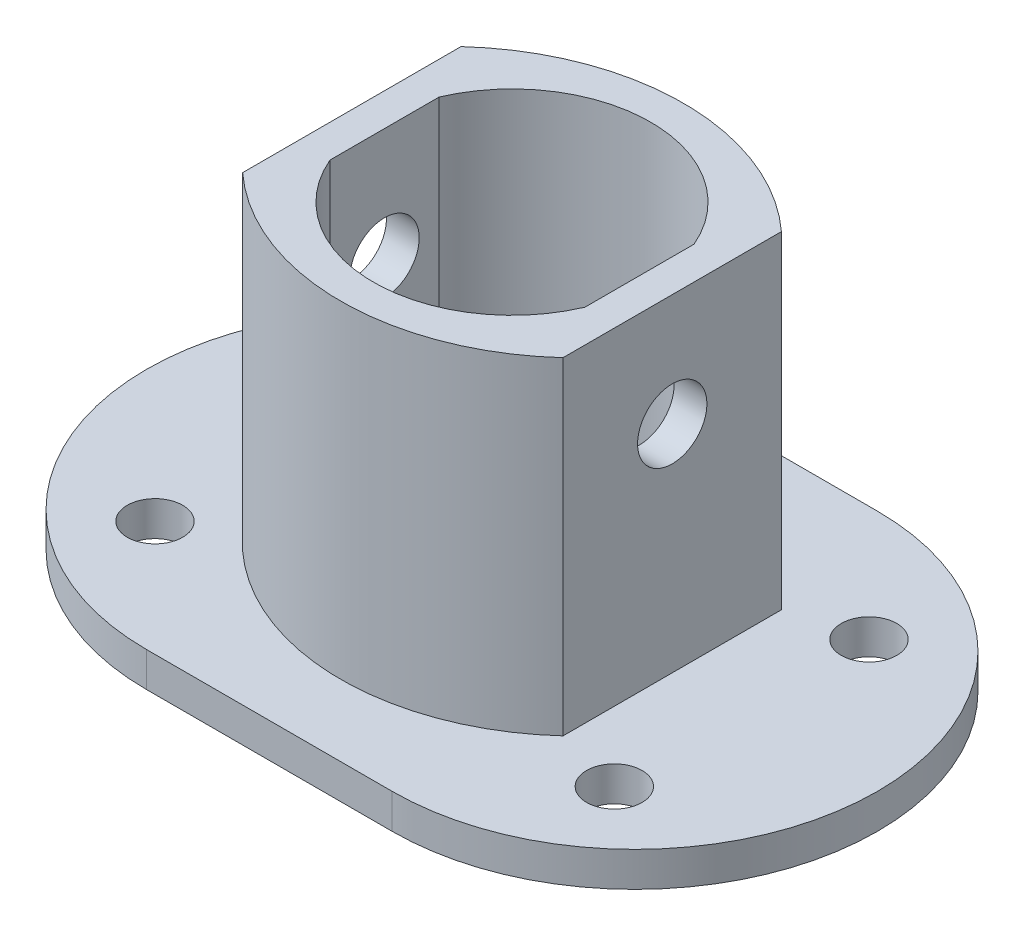
ISO-10303-21;
HEADER;
FILE_DESCRIPTION(('STEP AP214'),'2;1');
FILE_NAME('part.step','',(''),(''),'','','');
FILE_SCHEMA(('AUTOMOTIVE_DESIGN { 1 0 10303 214 1 1 1 1 }'));
ENDSEC;
DATA;
#1=APPLICATION_CONTEXT('core data for automotive mechanical design processes');
#2=APPLICATION_PROTOCOL_DEFINITION('international standard','automotive_design',2000,#1);
#3=PRODUCT_CONTEXT('',#1,'mechanical');
#4=PRODUCT('Part','Part','',(#3));
#5=PRODUCT_RELATED_PRODUCT_CATEGORY('part','',(#4));
#6=PRODUCT_DEFINITION_FORMATION('','',#4);
#7=PRODUCT_DEFINITION_CONTEXT('part definition',#1,'design');
#8=PRODUCT_DEFINITION('design','',#6,#7);
#9=PRODUCT_DEFINITION_SHAPE('','',#8);
#10=(LENGTH_UNIT() NAMED_UNIT(*) SI_UNIT(.MILLI.,.METRE.));
#11=(NAMED_UNIT(*) PLANE_ANGLE_UNIT() SI_UNIT($,.RADIAN.));
#12=(NAMED_UNIT(*) SI_UNIT($,.STERADIAN.) SOLID_ANGLE_UNIT());
#13=UNCERTAINTY_MEASURE_WITH_UNIT(LENGTH_MEASURE(1.E-05),#10,'distance_accuracy_value','');
#14=(GEOMETRIC_REPRESENTATION_CONTEXT(3) GLOBAL_UNCERTAINTY_ASSIGNED_CONTEXT((#13)) GLOBAL_UNIT_ASSIGNED_CONTEXT((#10,
#11,#12)) REPRESENTATION_CONTEXT('',''));
#15=CARTESIAN_POINT('',(0.,0.,0.));
#16=DIRECTION('',(0.,0.,1.));
#17=DIRECTION('',(1.,0.,0.));
#18=AXIS2_PLACEMENT_3D('',#15,#16,#17);
#19=CARTESIAN_POINT('',(-11.25,3.175,0.));
#20=DIRECTION('',(0.,1.,0.));
#21=DIRECTION('',(0.,0.,1.));
#22=AXIS2_PLACEMENT_3D('',#19,#20,#21);
#23=PLANE('',#22);
#24=CARTESIAN_POINT('',(-11.25,3.175,0.));
#25=DIRECTION('',(0.,1.,0.));
#26=DIRECTION('',(0.,0.,1.));
#27=AXIS2_PLACEMENT_3D('',#24,#25,#26);
#28=CIRCLE('',#27,22.225);
#29=CARTESIAN_POINT('',(-11.25,3.175,-22.225));
#30=VERTEX_POINT('',#29);
#31=CARTESIAN_POINT('',(-11.25,3.175,22.225));
#32=VERTEX_POINT('',#31);
#33=EDGE_CURVE('E222',#30,#32,#28,.T.);
#34=ORIENTED_EDGE('',*,*,#33,.T.);
#35=DIRECTION('',(1.,0.,0.));
#36=VECTOR('',#35,1.);
#37=CARTESIAN_POINT('',(-11.25,3.175,22.225));
#38=LINE('',#37,#36);
#39=CARTESIAN_POINT('',(11.25,3.175,22.225));
#40=VERTEX_POINT('',#39);
#41=EDGE_CURVE('E225',#32,#40,#38,.T.);
#42=ORIENTED_EDGE('',*,*,#41,.T.);
#43=CARTESIAN_POINT('',(11.25,3.175,0.));
#44=DIRECTION('',(0.,1.,0.));
#45=DIRECTION('',(0.,0.,1.));
#46=AXIS2_PLACEMENT_3D('',#43,#44,#45);
#47=CIRCLE('',#46,22.225);
#48=CARTESIAN_POINT('',(11.25,3.175,-22.225));
#49=VERTEX_POINT('',#48);
#50=EDGE_CURVE('E228',#40,#49,#47,.T.);
#51=ORIENTED_EDGE('',*,*,#50,.T.);
#52=DIRECTION('',(-1.,0.,0.));
#53=VECTOR('',#52,1.);
#54=CARTESIAN_POINT('',(-11.25,3.175,-22.225));
#55=LINE('',#54,#53);
#56=EDGE_CURVE('E230',#49,#30,#55,.T.);
#57=ORIENTED_EDGE('',*,*,#56,.T.);
#58=EDGE_LOOP('',(#34,#42,#51,#57));
#59=FACE_BOUND('',#58,.T.);
#60=CARTESIAN_POINT('',(-21.0364413574776,3.175,11.6630266464864));
#61=DIRECTION('',(0.,1.,0.));
#62=DIRECTION('',(0.,0.,1.));
#63=AXIS2_PLACEMENT_3D('',#60,#61,#62);
#64=CIRCLE('',#63,2.54);
#65=CARTESIAN_POINT('',(-21.0364413574776,3.175,14.2030266464864));
#66=VERTEX_POINT('',#65);
#67=EDGE_CURVE('E207',#66,#66,#64,.T.);
#68=ORIENTED_EDGE('',*,*,#67,.F.);
#69=EDGE_LOOP('',(#68));
#70=FACE_BOUND('',#69,.T.);
#71=CARTESIAN_POINT('',(21.0364413574776,3.175,-11.6630266464864));
#72=DIRECTION('',(0.,1.,0.));
#73=DIRECTION('',(0.,0.,-1.));
#74=AXIS2_PLACEMENT_3D('',#71,#72,#73);
#75=CIRCLE('',#74,2.54);
#76=CARTESIAN_POINT('',(21.0364413574776,3.175,-14.2030266464864));
#77=VERTEX_POINT('',#76);
#78=EDGE_CURVE('E197',#77,#77,#75,.T.);
#79=ORIENTED_EDGE('',*,*,#78,.F.);
#80=EDGE_LOOP('',(#79));
#81=FACE_BOUND('',#80,.T.);
#82=CARTESIAN_POINT('',(21.0364413574776,3.175,11.6630266464864));
#83=DIRECTION('',(0.,1.,0.));
#84=DIRECTION('',(0.,0.,-1.));
#85=AXIS2_PLACEMENT_3D('',#82,#83,#84);
#86=CIRCLE('',#85,2.54);
#87=CARTESIAN_POINT('',(21.0364413574776,3.175,9.12302664648642));
#88=VERTEX_POINT('',#87);
#89=EDGE_CURVE('E201',#88,#88,#86,.T.);
#90=ORIENTED_EDGE('',*,*,#89,.F.);
#91=EDGE_LOOP('',(#90));
#92=FACE_BOUND('',#91,.T.);
#93=CARTESIAN_POINT('',(-21.0364413574776,3.175,-11.6630266464864));
#94=DIRECTION('',(0.,1.,0.));
#95=DIRECTION('',(0.,0.,1.));
#96=AXIS2_PLACEMENT_3D('',#93,#94,#95);
#97=CIRCLE('',#96,2.54);
#98=CARTESIAN_POINT('',(-21.0364413574776,3.175,-9.12302664648642));
#99=VERTEX_POINT('',#98);
#100=EDGE_CURVE('E208',#99,#99,#97,.T.);
#101=ORIENTED_EDGE('',*,*,#100,.F.);
#102=EDGE_LOOP('',(#101));
#103=FACE_BOUND('',#102,.T.);
#104=DIRECTION('',(0.,0.,1.));
#105=VECTOR('',#104,1.);
#106=CARTESIAN_POINT('',(-14.6743308159397,3.175,10.));
#107=LINE('',#106,#105);
#108=CARTESIAN_POINT('',(-14.6743308159397,3.175,-10.));
#109=VERTEX_POINT('',#108);
#110=CARTESIAN_POINT('',(-14.6743308159397,3.175,10.));
#111=VERTEX_POINT('',#110);
#112=EDGE_CURVE('E184',#109,#111,#107,.T.);
#113=ORIENTED_EDGE('',*,*,#112,.F.);
#114=CARTESIAN_POINT('',(0.,3.175,6.03912148207358));
#115=DIRECTION('',(0.,1.,0.));
#116=DIRECTION('',(0.,0.,-1.));
#117=AXIS2_PLACEMENT_3D('',#114,#115,#116);
#118=CIRCLE('',#117,21.7391214820736);
#119=CARTESIAN_POINT('',(14.6743308159397,3.175,-10.));
#120=VERTEX_POINT('',#119);
#121=EDGE_CURVE('E147',#120,#109,#118,.T.);
#122=ORIENTED_EDGE('',*,*,#121,.F.);
#123=DIRECTION('',(0.,0.,-1.));
#124=VECTOR('',#123,1.);
#125=CARTESIAN_POINT('',(14.6743308159397,3.175,10.));
#126=LINE('',#125,#124);
#127=CARTESIAN_POINT('',(14.6743308159397,3.175,10.));
#128=VERTEX_POINT('',#127);
#129=EDGE_CURVE('E175',#128,#120,#126,.T.);
#130=ORIENTED_EDGE('',*,*,#129,.F.);
#131=CARTESIAN_POINT('',(0.,3.175,-6.03912148207357));
#132=DIRECTION('',(0.,1.,0.));
#133=DIRECTION('',(0.,0.,1.));
#134=AXIS2_PLACEMENT_3D('',#131,#132,#133);
#135=CIRCLE('',#134,21.7391214820736);
#136=EDGE_CURVE('E186',#111,#128,#135,.T.);
#137=ORIENTED_EDGE('',*,*,#136,.F.);
#138=EDGE_LOOP('',(#113,#122,#130,#137));
#139=FACE_BOUND('',#138,.T.);
#140=ADVANCED_FACE('F38',(#59,#70,#81,#92,#103,#139),#23,.T.);
#141=CARTESIAN_POINT('',(-11.25,3.175,0.));
#142=DIRECTION('',(0.,-1.,0.));
#143=DIRECTION('',(0.,0.,-1.));
#144=AXIS2_PLACEMENT_3D('',#141,#142,#143);
#145=CYLINDRICAL_SURFACE('',#144,22.225);
#146=CARTESIAN_POINT('',(-11.25,0.,0.));
#147=DIRECTION('',(0.,1.,0.));
#148=DIRECTION('',(0.,0.,1.));
#149=AXIS2_PLACEMENT_3D('',#146,#147,#148);
#150=CIRCLE('',#149,22.225);
#151=CARTESIAN_POINT('',(-11.25,0.,-22.225));
#152=VERTEX_POINT('',#151);
#153=CARTESIAN_POINT('',(-11.25,0.,22.225));
#154=VERTEX_POINT('',#153);
#155=EDGE_CURVE('E219',#152,#154,#150,.T.);
#156=ORIENTED_EDGE('',*,*,#155,.T.);
#157=DIRECTION('',(0.,-1.,0.));
#158=VECTOR('',#157,1.);
#159=CARTESIAN_POINT('',(-11.25,3.175,22.225));
#160=LINE('',#159,#158);
#161=EDGE_CURVE('E11',#32,#154,#160,.T.);
#162=ORIENTED_EDGE('',*,*,#161,.F.);
#163=ORIENTED_EDGE('',*,*,#33,.F.);
#164=DIRECTION('',(0.,-1.,0.));
#165=VECTOR('',#164,1.);
#166=CARTESIAN_POINT('',(-11.25,3.175,-22.225));
#167=LINE('',#166,#165);
#168=EDGE_CURVE('E232',#30,#152,#167,.T.);
#169=ORIENTED_EDGE('',*,*,#168,.T.);
#170=EDGE_LOOP('',(#156,#162,#163,#169));
#171=FACE_BOUND('',#170,.T.);
#172=ADVANCED_FACE('F40',(#171),#145,.T.);
#173=CARTESIAN_POINT('',(-11.25,3.175,22.225));
#174=DIRECTION('',(0.,0.,-1.));
#175=DIRECTION('',(-1.,0.,0.));
#176=AXIS2_PLACEMENT_3D('',#173,#174,#175);
#177=PLANE('',#176);
#178=DIRECTION('',(1.,0.,0.));
#179=VECTOR('',#178,1.);
#180=CARTESIAN_POINT('',(-11.25,0.,22.225));
#181=LINE('',#180,#179);
#182=CARTESIAN_POINT('',(11.25,0.,22.225));
#183=VERTEX_POINT('',#182);
#184=EDGE_CURVE('E235',#154,#183,#181,.T.);
#185=ORIENTED_EDGE('',*,*,#184,.T.);
#186=DIRECTION('',(0.,-1.,0.));
#187=VECTOR('',#186,1.);
#188=CARTESIAN_POINT('',(11.25,3.175,22.225));
#189=LINE('',#188,#187);
#190=EDGE_CURVE('E47',#40,#183,#189,.T.);
#191=ORIENTED_EDGE('',*,*,#190,.F.);
#192=ORIENTED_EDGE('',*,*,#41,.F.);
#193=ORIENTED_EDGE('',*,*,#161,.T.);
#194=EDGE_LOOP('',(#185,#191,#192,#193));
#195=FACE_BOUND('',#194,.T.);
#196=ADVANCED_FACE('F266',(#195),#177,.F.);
#197=CARTESIAN_POINT('',(11.25,3.175,0.));
#198=DIRECTION('',(0.,-1.,0.));
#199=DIRECTION('',(0.,0.,-1.));
#200=AXIS2_PLACEMENT_3D('',#197,#198,#199);
#201=CYLINDRICAL_SURFACE('',#200,22.225);
#202=CARTESIAN_POINT('',(11.25,0.,0.));
#203=DIRECTION('',(0.,1.,0.));
#204=DIRECTION('',(0.,0.,1.));
#205=AXIS2_PLACEMENT_3D('',#202,#203,#204);
#206=CIRCLE('',#205,22.225);
#207=CARTESIAN_POINT('',(11.25,0.,-22.225));
#208=VERTEX_POINT('',#207);
#209=EDGE_CURVE('E237',#183,#208,#206,.T.);
#210=ORIENTED_EDGE('',*,*,#209,.T.);
#211=DIRECTION('',(0.,-1.,0.));
#212=VECTOR('',#211,1.);
#213=CARTESIAN_POINT('',(11.25,3.175,-22.225));
#214=LINE('',#213,#212);
#215=EDGE_CURVE('E242',#49,#208,#214,.T.);
#216=ORIENTED_EDGE('',*,*,#215,.F.);
#217=ORIENTED_EDGE('',*,*,#50,.F.);
#218=ORIENTED_EDGE('',*,*,#190,.T.);
#219=EDGE_LOOP('',(#210,#216,#217,#218));
#220=FACE_BOUND('',#219,.T.);
#221=ADVANCED_FACE('F250',(#220),#201,.T.);
#222=CARTESIAN_POINT('',(-11.25,3.175,-22.225));
#223=DIRECTION('',(0.,0.,1.));
#224=DIRECTION('',(1.,0.,0.));
#225=AXIS2_PLACEMENT_3D('',#222,#223,#224);
#226=PLANE('',#225);
#227=DIRECTION('',(-1.,0.,0.));
#228=VECTOR('',#227,1.);
#229=CARTESIAN_POINT('',(-11.25,0.,-22.225));
#230=LINE('',#229,#228);
#231=EDGE_CURVE('E226',#208,#152,#230,.T.);
#232=ORIENTED_EDGE('',*,*,#231,.T.);
#233=ORIENTED_EDGE('',*,*,#168,.F.);
#234=ORIENTED_EDGE('',*,*,#56,.F.);
#235=ORIENTED_EDGE('',*,*,#215,.T.);
#236=EDGE_LOOP('',(#232,#233,#234,#235));
#237=FACE_BOUND('',#236,.T.);
#238=ADVANCED_FACE('F259',(#237),#226,.F.);
#239=CARTESIAN_POINT('',(-11.25,0.,0.));
#240=DIRECTION('',(0.,1.,0.));
#241=DIRECTION('',(0.,0.,1.));
#242=AXIS2_PLACEMENT_3D('',#239,#240,#241);
#243=PLANE('',#242);
#244=CARTESIAN_POINT('',(0.,0.,0.));
#245=DIRECTION('',(0.,1.,0.));
#246=DIRECTION('',(0.,0.,1.));
#247=AXIS2_PLACEMENT_3D('',#244,#245,#246);
#248=CIRCLE('',#247,6.35);
#249=CARTESIAN_POINT('',(0.,0.,6.35));
#250=VERTEX_POINT('',#249);
#251=EDGE_CURVE('E161',#250,#250,#248,.T.);
#252=ORIENTED_EDGE('',*,*,#251,.T.);
#253=EDGE_LOOP('',(#252));
#254=FACE_BOUND('',#253,.T.);
#255=CARTESIAN_POINT('',(-21.0364413574776,0.,-11.6630266464864));
#256=DIRECTION('',(0.,1.,0.));
#257=DIRECTION('',(0.,0.,1.));
#258=AXIS2_PLACEMENT_3D('',#255,#256,#257);
#259=CIRCLE('',#258,2.54);
#260=CARTESIAN_POINT('',(-21.0364413574776,0.,-9.12302664648642));
#261=VERTEX_POINT('',#260);
#262=EDGE_CURVE('E204',#261,#261,#259,.T.);
#263=ORIENTED_EDGE('',*,*,#262,.T.);
#264=EDGE_LOOP('',(#263));
#265=FACE_BOUND('',#264,.T.);
#266=CARTESIAN_POINT('',(21.0364413574776,0.,11.6630266464864));
#267=DIRECTION('',(0.,1.,0.));
#268=DIRECTION('',(0.,0.,-1.));
#269=AXIS2_PLACEMENT_3D('',#266,#267,#268);
#270=CIRCLE('',#269,2.54);
#271=CARTESIAN_POINT('',(21.0364413574776,0.,9.12302664648642));
#272=VERTEX_POINT('',#271);
#273=EDGE_CURVE('E211',#272,#272,#270,.T.);
#274=ORIENTED_EDGE('',*,*,#273,.T.);
#275=EDGE_LOOP('',(#274));
#276=FACE_BOUND('',#275,.T.);
#277=CARTESIAN_POINT('',(21.0364413574776,0.,-11.6630266464864));
#278=DIRECTION('',(0.,1.,0.));
#279=DIRECTION('',(0.,0.,-1.));
#280=AXIS2_PLACEMENT_3D('',#277,#278,#279);
#281=CIRCLE('',#280,2.54);
#282=CARTESIAN_POINT('',(21.0364413574776,0.,-14.2030266464864));
#283=VERTEX_POINT('',#282);
#284=EDGE_CURVE('E198',#283,#283,#281,.T.);
#285=ORIENTED_EDGE('',*,*,#284,.T.);
#286=EDGE_LOOP('',(#285));
#287=FACE_BOUND('',#286,.T.);
#288=CARTESIAN_POINT('',(-21.0364413574776,0.,11.6630266464864));
#289=DIRECTION('',(0.,1.,0.));
#290=DIRECTION('',(0.,0.,1.));
#291=AXIS2_PLACEMENT_3D('',#288,#289,#290);
#292=CIRCLE('',#291,2.54);
#293=CARTESIAN_POINT('',(-21.0364413574776,0.,14.2030266464864));
#294=VERTEX_POINT('',#293);
#295=EDGE_CURVE('E216',#294,#294,#292,.T.);
#296=ORIENTED_EDGE('',*,*,#295,.T.);
#297=EDGE_LOOP('',(#296));
#298=FACE_BOUND('',#297,.T.);
#299=ORIENTED_EDGE('',*,*,#155,.F.);
#300=ORIENTED_EDGE('',*,*,#231,.F.);
#301=ORIENTED_EDGE('',*,*,#209,.F.);
#302=ORIENTED_EDGE('',*,*,#184,.F.);
#303=EDGE_LOOP('',(#299,#300,#301,#302));
#304=FACE_BOUND('',#303,.T.);
#305=ADVANCED_FACE('F256',(#254,#265,#276,#287,#298,#304),#243,.F.);
#306=CARTESIAN_POINT('',(-21.0364413574776,0.,11.6630266464864));
#307=DIRECTION('',(0.,1.,0.));
#308=DIRECTION('',(0.,0.,1.));
#309=AXIS2_PLACEMENT_3D('',#306,#307,#308);
#310=CYLINDRICAL_SURFACE('',#309,2.54);
#311=ORIENTED_EDGE('',*,*,#295,.F.);
#312=EDGE_LOOP('',(#311));
#313=FACE_BOUND('',#312,.T.);
#314=ORIENTED_EDGE('',*,*,#67,.T.);
#315=EDGE_LOOP('',(#314));
#316=FACE_BOUND('',#315,.T.);
#317=ADVANCED_FACE('F353',(#313,#316),#310,.F.);
#318=CARTESIAN_POINT('',(21.0364413574776,0.,-11.6630266464864));
#319=DIRECTION('',(0.,1.,0.));
#320=DIRECTION('',(0.,0.,1.));
#321=AXIS2_PLACEMENT_3D('',#318,#319,#320);
#322=CYLINDRICAL_SURFACE('',#321,2.54);
#323=ORIENTED_EDGE('',*,*,#284,.F.);
#324=EDGE_LOOP('',(#323));
#325=FACE_BOUND('',#324,.T.);
#326=ORIENTED_EDGE('',*,*,#78,.T.);
#327=EDGE_LOOP('',(#326));
#328=FACE_BOUND('',#327,.T.);
#329=ADVANCED_FACE('F349',(#325,#328),#322,.F.);
#330=CARTESIAN_POINT('',(21.0364413574776,0.,11.6630266464864));
#331=DIRECTION('',(0.,1.,0.));
#332=DIRECTION('',(0.,0.,1.));
#333=AXIS2_PLACEMENT_3D('',#330,#331,#332);
#334=CYLINDRICAL_SURFACE('',#333,2.54);
#335=ORIENTED_EDGE('',*,*,#273,.F.);
#336=EDGE_LOOP('',(#335));
#337=FACE_BOUND('',#336,.T.);
#338=ORIENTED_EDGE('',*,*,#89,.T.);
#339=EDGE_LOOP('',(#338));
#340=FACE_BOUND('',#339,.T.);
#341=ADVANCED_FACE('F352',(#337,#340),#334,.F.);
#342=CARTESIAN_POINT('',(-21.0364413574776,0.,-11.6630266464864));
#343=DIRECTION('',(0.,1.,0.));
#344=DIRECTION('',(0.,0.,1.));
#345=AXIS2_PLACEMENT_3D('',#342,#343,#344);
#346=CYLINDRICAL_SURFACE('',#345,2.54);
#347=ORIENTED_EDGE('',*,*,#262,.F.);
#348=EDGE_LOOP('',(#347));
#349=FACE_BOUND('',#348,.T.);
#350=ORIENTED_EDGE('',*,*,#100,.T.);
#351=EDGE_LOOP('',(#350));
#352=FACE_BOUND('',#351,.T.);
#353=ADVANCED_FACE('F333',(#349,#352),#346,.F.);
#354=CARTESIAN_POINT('',(0.,33.175,6.03912148207358));
#355=DIRECTION('',(0.,-1.,0.));
#356=DIRECTION('',(0.,0.,-1.));
#357=AXIS2_PLACEMENT_3D('',#354,#355,#356);
#358=PLANE('',#357);
#359=CARTESIAN_POINT('',(0.,33.175,6.03912148207358));
#360=DIRECTION('',(0.,1.,0.));
#361=DIRECTION('',(0.,0.,-1.));
#362=AXIS2_PLACEMENT_3D('',#359,#360,#361);
#363=CIRCLE('',#362,21.7391214820736);
#364=CARTESIAN_POINT('',(14.6743308159397,33.175,-10.));
#365=VERTEX_POINT('',#364);
#366=CARTESIAN_POINT('',(-14.6743308159397,33.175,-10.));
#367=VERTEX_POINT('',#366);
#368=EDGE_CURVE('E171',#365,#367,#363,.T.);
#369=ORIENTED_EDGE('',*,*,#368,.T.);
#370=DIRECTION('',(0.,0.,1.));
#371=VECTOR('',#370,1.);
#372=CARTESIAN_POINT('',(-14.6743308159397,33.175,10.));
#373=LINE('',#372,#371);
#374=CARTESIAN_POINT('',(-14.6743308159397,33.175,10.));
#375=VERTEX_POINT('',#374);
#376=EDGE_CURVE('E174',#367,#375,#373,.T.);
#377=ORIENTED_EDGE('',*,*,#376,.T.);
#378=CARTESIAN_POINT('',(0.,33.175,-6.03912148207357));
#379=DIRECTION('',(0.,1.,0.));
#380=DIRECTION('',(0.,0.,1.));
#381=AXIS2_PLACEMENT_3D('',#378,#379,#380);
#382=CIRCLE('',#381,21.7391214820736);
#383=CARTESIAN_POINT('',(14.6743308159397,33.175,10.));
#384=VERTEX_POINT('',#383);
#385=EDGE_CURVE('E177',#375,#384,#382,.T.);
#386=ORIENTED_EDGE('',*,*,#385,.T.);
#387=DIRECTION('',(0.,0.,-1.));
#388=VECTOR('',#387,1.);
#389=CARTESIAN_POINT('',(14.6743308159397,33.175,10.));
#390=LINE('',#389,#388);
#391=EDGE_CURVE('E179',#384,#365,#390,.T.);
#392=ORIENTED_EDGE('',*,*,#391,.T.);
#393=EDGE_LOOP('',(#369,#377,#386,#392));
#394=FACE_BOUND('',#393,.T.);
#395=CARTESIAN_POINT('',(0.,33.175,0.));
#396=DIRECTION('',(0.,1.,0.));
#397=DIRECTION('',(0.,0.,1.));
#398=AXIS2_PLACEMENT_3D('',#395,#396,#397);
#399=CIRCLE('',#398,12.7);
#400=CARTESIAN_POINT('',(11.6743308159397,33.175,-5.));
#401=VERTEX_POINT('',#400);
#402=CARTESIAN_POINT('',(-11.6743308159397,33.175,-5.));
#403=VERTEX_POINT('',#402);
#404=EDGE_CURVE('E130',#401,#403,#399,.T.);
#405=ORIENTED_EDGE('',*,*,#404,.F.);
#406=DIRECTION('',(0.,0.,-1.));
#407=VECTOR('',#406,1.);
#408=CARTESIAN_POINT('',(11.6743308159397,33.175,5.));
#409=LINE('',#408,#407);
#410=CARTESIAN_POINT('',(11.6743308159397,33.175,5.));
#411=VERTEX_POINT('',#410);
#412=EDGE_CURVE('E155',#411,#401,#409,.T.);
#413=ORIENTED_EDGE('',*,*,#412,.F.);
#414=CARTESIAN_POINT('',(0.,33.175,0.));
#415=DIRECTION('',(0.,1.,0.));
#416=DIRECTION('',(0.,0.,1.));
#417=AXIS2_PLACEMENT_3D('',#414,#415,#416);
#418=CIRCLE('',#417,12.7);
#419=CARTESIAN_POINT('',(-11.6743308159397,33.175,5.));
#420=VERTEX_POINT('',#419);
#421=EDGE_CURVE('E153',#420,#411,#418,.T.);
#422=ORIENTED_EDGE('',*,*,#421,.F.);
#423=DIRECTION('',(0.,0.,1.));
#424=VECTOR('',#423,1.);
#425=CARTESIAN_POINT('',(-11.6743308159397,33.175,-5.));
#426=LINE('',#425,#424);
#427=EDGE_CURVE('E139',#403,#420,#426,.T.);
#428=ORIENTED_EDGE('',*,*,#427,.F.);
#429=EDGE_LOOP('',(#405,#413,#422,#428));
#430=FACE_BOUND('',#429,.T.);
#431=ADVANCED_FACE('F151',(#394,#430),#358,.F.);
#432=CARTESIAN_POINT('',(0.,33.175,6.03912148207358));
#433=DIRECTION('',(0.,-1.,0.));
#434=DIRECTION('',(0.,0.,-1.));
#435=AXIS2_PLACEMENT_3D('',#432,#433,#434);
#436=CYLINDRICAL_SURFACE('',#435,21.7391214820736);
#437=ORIENTED_EDGE('',*,*,#121,.T.);
#438=DIRECTION('',(0.,-1.,0.));
#439=VECTOR('',#438,1.);
#440=CARTESIAN_POINT('',(-14.6743308159397,33.175,-10.));
#441=LINE('',#440,#439);
#442=EDGE_CURVE('E195',#367,#109,#441,.T.);
#443=ORIENTED_EDGE('',*,*,#442,.F.);
#444=ORIENTED_EDGE('',*,*,#368,.F.);
#445=DIRECTION('',(0.,-1.,0.));
#446=VECTOR('',#445,1.);
#447=CARTESIAN_POINT('',(14.6743308159397,33.175,-10.));
#448=LINE('',#447,#446);
#449=EDGE_CURVE('E181',#365,#120,#448,.T.);
#450=ORIENTED_EDGE('',*,*,#449,.T.);
#451=EDGE_LOOP('',(#437,#443,#444,#450));
#452=FACE_BOUND('',#451,.T.);
#453=ADVANCED_FACE('F332',(#452),#436,.T.);
#454=CARTESIAN_POINT('',(-14.6743308159397,33.175,10.));
#455=DIRECTION('',(1.,0.,0.));
#456=DIRECTION('',(0.,0.,-1.));
#457=AXIS2_PLACEMENT_3D('',#454,#455,#456);
#458=PLANE('',#457);
#459=CARTESIAN_POINT('',(-14.6743308159397,22.925,0.));
#460=DIRECTION('',(-1.,0.,0.));
#461=DIRECTION('',(0.,0.,1.));
#462=AXIS2_PLACEMENT_3D('',#459,#460,#461);
#463=CIRCLE('',#462,3.175);
#464=CARTESIAN_POINT('',(-14.6743308159397,22.925,3.175));
#465=VERTEX_POINT('',#464);
#466=EDGE_CURVE('E307',#465,#465,#463,.T.);
#467=ORIENTED_EDGE('',*,*,#466,.F.);
#468=EDGE_LOOP('',(#467));
#469=FACE_BOUND('',#468,.T.);
#470=ORIENTED_EDGE('',*,*,#112,.T.);
#471=DIRECTION('',(0.,-1.,0.));
#472=VECTOR('',#471,1.);
#473=CARTESIAN_POINT('',(-14.6743308159397,33.175,10.));
#474=LINE('',#473,#472);
#475=EDGE_CURVE('E192',#375,#111,#474,.T.);
#476=ORIENTED_EDGE('',*,*,#475,.F.);
#477=ORIENTED_EDGE('',*,*,#376,.F.);
#478=ORIENTED_EDGE('',*,*,#442,.T.);
#479=EDGE_LOOP('',(#470,#476,#477,#478));
#480=FACE_BOUND('',#479,.T.);
#481=ADVANCED_FACE('F341',(#469,#480),#458,.F.);
#482=CARTESIAN_POINT('',(0.,33.175,-6.03912148207357));
#483=DIRECTION('',(0.,-1.,0.));
#484=DIRECTION('',(0.,0.,-1.));
#485=AXIS2_PLACEMENT_3D('',#482,#483,#484);
#486=CYLINDRICAL_SURFACE('',#485,21.7391214820736);
#487=ORIENTED_EDGE('',*,*,#136,.T.);
#488=DIRECTION('',(0.,-1.,0.));
#489=VECTOR('',#488,1.);
#490=CARTESIAN_POINT('',(14.6743308159397,33.175,10.));
#491=LINE('',#490,#489);
#492=EDGE_CURVE('E54',#384,#128,#491,.T.);
#493=ORIENTED_EDGE('',*,*,#492,.F.);
#494=ORIENTED_EDGE('',*,*,#385,.F.);
#495=ORIENTED_EDGE('',*,*,#475,.T.);
#496=EDGE_LOOP('',(#487,#493,#494,#495));
#497=FACE_BOUND('',#496,.T.);
#498=ADVANCED_FACE('F337',(#497),#486,.T.);
#499=CARTESIAN_POINT('',(14.6743308159397,33.175,10.));
#500=DIRECTION('',(-1.,0.,0.));
#501=DIRECTION('',(0.,0.,1.));
#502=AXIS2_PLACEMENT_3D('',#499,#500,#501);
#503=PLANE('',#502);
#504=CARTESIAN_POINT('',(14.6743308159397,22.925,0.));
#505=DIRECTION('',(-1.,0.,0.));
#506=DIRECTION('',(0.,0.,1.));
#507=AXIS2_PLACEMENT_3D('',#504,#505,#506);
#508=CIRCLE('',#507,3.175);
#509=CARTESIAN_POINT('',(14.6743308159397,22.925,3.175));
#510=VERTEX_POINT('',#509);
#511=EDGE_CURVE('E298',#510,#510,#508,.T.);
#512=ORIENTED_EDGE('',*,*,#511,.T.);
#513=EDGE_LOOP('',(#512));
#514=FACE_BOUND('',#513,.T.);
#515=ORIENTED_EDGE('',*,*,#129,.T.);
#516=ORIENTED_EDGE('',*,*,#449,.F.);
#517=ORIENTED_EDGE('',*,*,#391,.F.);
#518=ORIENTED_EDGE('',*,*,#492,.T.);
#519=EDGE_LOOP('',(#515,#516,#517,#518));
#520=FACE_BOUND('',#519,.T.);
#521=ADVANCED_FACE('F329',(#514,#520),#503,.F.);
#522=CARTESIAN_POINT('',(0.,33.175,0.));
#523=DIRECTION('',(0.,-1.,0.));
#524=DIRECTION('',(0.,0.,-1.));
#525=AXIS2_PLACEMENT_3D('',#522,#523,#524);
#526=CYLINDRICAL_SURFACE('',#525,12.7);
#527=CARTESIAN_POINT('',(0.,3.175,0.));
#528=DIRECTION('',(0.,1.,0.));
#529=DIRECTION('',(0.,0.,1.));
#530=AXIS2_PLACEMENT_3D('',#527,#528,#529);
#531=CIRCLE('',#530,12.7);
#532=CARTESIAN_POINT('',(11.6743308159397,3.175,-5.));
#533=VERTEX_POINT('',#532);
#534=CARTESIAN_POINT('',(-11.6743308159397,3.175,-5.));
#535=VERTEX_POINT('',#534);
#536=EDGE_CURVE('E62',#533,#535,#531,.T.);
#537=ORIENTED_EDGE('',*,*,#536,.F.);
#538=DIRECTION('',(0.,-1.,0.));
#539=VECTOR('',#538,1.);
#540=CARTESIAN_POINT('',(11.6743308159397,33.175,-5.));
#541=LINE('',#540,#539);
#542=EDGE_CURVE('E135',#401,#533,#541,.T.);
#543=ORIENTED_EDGE('',*,*,#542,.F.);
#544=ORIENTED_EDGE('',*,*,#404,.T.);
#545=DIRECTION('',(0.,-1.,0.));
#546=VECTOR('',#545,1.);
#547=CARTESIAN_POINT('',(-11.6743308159397,33.175,-5.));
#548=LINE('',#547,#546);
#549=EDGE_CURVE('E133',#403,#535,#548,.T.);
#550=ORIENTED_EDGE('',*,*,#549,.T.);
#551=EDGE_LOOP('',(#537,#543,#544,#550));
#552=FACE_BOUND('',#551,.T.);
#553=ADVANCED_FACE('F132',(#552),#526,.F.);
#554=CARTESIAN_POINT('',(-11.6743308159397,33.175,-5.));
#555=DIRECTION('',(1.,0.,0.));
#556=DIRECTION('',(0.,0.,-1.));
#557=AXIS2_PLACEMENT_3D('',#554,#555,#556);
#558=PLANE('',#557);
#559=CARTESIAN_POINT('',(-11.6743308159397,22.925,0.));
#560=DIRECTION('',(1.,0.,0.));
#561=DIRECTION('',(0.,0.,-1.));
#562=AXIS2_PLACEMENT_3D('',#559,#560,#561);
#563=CIRCLE('',#562,3.175);
#564=CARTESIAN_POINT('',(-11.6743308159397,22.925,-3.175));
#565=VERTEX_POINT('',#564);
#566=EDGE_CURVE('E302',#565,#565,#563,.T.);
#567=ORIENTED_EDGE('',*,*,#566,.F.);
#568=EDGE_LOOP('',(#567));
#569=FACE_BOUND('',#568,.T.);
#570=DIRECTION('',(0.,0.,1.));
#571=VECTOR('',#570,1.);
#572=CARTESIAN_POINT('',(-11.6743308159397,3.175,-5.));
#573=LINE('',#572,#571);
#574=CARTESIAN_POINT('',(-11.6743308159397,3.175,5.));
#575=VERTEX_POINT('',#574);
#576=EDGE_CURVE('E146',#535,#575,#573,.T.);
#577=ORIENTED_EDGE('',*,*,#576,.F.);
#578=ORIENTED_EDGE('',*,*,#549,.F.);
#579=ORIENTED_EDGE('',*,*,#427,.T.);
#580=DIRECTION('',(0.,-1.,0.));
#581=VECTOR('',#580,1.);
#582=CARTESIAN_POINT('',(-11.6743308159397,33.175,5.));
#583=LINE('',#582,#581);
#584=EDGE_CURVE('E148',#420,#575,#583,.T.);
#585=ORIENTED_EDGE('',*,*,#584,.T.);
#586=EDGE_LOOP('',(#577,#578,#579,#585));
#587=FACE_BOUND('',#586,.T.);
#588=ADVANCED_FACE('F143',(#569,#587),#558,.T.);
#589=CARTESIAN_POINT('',(0.,33.175,0.));
#590=DIRECTION('',(0.,-1.,0.));
#591=DIRECTION('',(0.,0.,-1.));
#592=AXIS2_PLACEMENT_3D('',#589,#590,#591);
#593=CYLINDRICAL_SURFACE('',#592,12.7);
#594=CARTESIAN_POINT('',(0.,3.175,0.));
#595=DIRECTION('',(0.,1.,0.));
#596=DIRECTION('',(0.,0.,1.));
#597=AXIS2_PLACEMENT_3D('',#594,#595,#596);
#598=CIRCLE('',#597,12.7);
#599=CARTESIAN_POINT('',(11.6743308159397,3.175,5.));
#600=VERTEX_POINT('',#599);
#601=EDGE_CURVE('E163',#575,#600,#598,.T.);
#602=ORIENTED_EDGE('',*,*,#601,.F.);
#603=ORIENTED_EDGE('',*,*,#584,.F.);
#604=ORIENTED_EDGE('',*,*,#421,.T.);
#605=DIRECTION('',(0.,-1.,0.));
#606=VECTOR('',#605,1.);
#607=CARTESIAN_POINT('',(11.6743308159397,33.175,5.));
#608=LINE('',#607,#606);
#609=EDGE_CURVE('E167',#411,#600,#608,.T.);
#610=ORIENTED_EDGE('',*,*,#609,.T.);
#611=EDGE_LOOP('',(#602,#603,#604,#610));
#612=FACE_BOUND('',#611,.T.);
#613=ADVANCED_FACE('F291',(#612),#593,.F.);
#614=CARTESIAN_POINT('',(11.6743308159397,33.175,5.));
#615=DIRECTION('',(-1.,0.,0.));
#616=DIRECTION('',(0.,0.,1.));
#617=AXIS2_PLACEMENT_3D('',#614,#615,#616);
#618=PLANE('',#617);
#619=CARTESIAN_POINT('',(11.6743308159397,22.925,0.));
#620=DIRECTION('',(-1.,0.,0.));
#621=DIRECTION('',(0.,0.,1.));
#622=AXIS2_PLACEMENT_3D('',#619,#620,#621);
#623=CIRCLE('',#622,3.175);
#624=CARTESIAN_POINT('',(11.6743308159397,22.925,3.175));
#625=VERTEX_POINT('',#624);
#626=EDGE_CURVE('E42',#625,#625,#623,.T.);
#627=ORIENTED_EDGE('',*,*,#626,.F.);
#628=EDGE_LOOP('',(#627));
#629=FACE_BOUND('',#628,.T.);
#630=DIRECTION('',(0.,0.,-1.));
#631=VECTOR('',#630,1.);
#632=CARTESIAN_POINT('',(11.6743308159397,3.175,5.));
#633=LINE('',#632,#631);
#634=EDGE_CURVE('E140',#600,#533,#633,.T.);
#635=ORIENTED_EDGE('',*,*,#634,.F.);
#636=ORIENTED_EDGE('',*,*,#609,.F.);
#637=ORIENTED_EDGE('',*,*,#412,.T.);
#638=ORIENTED_EDGE('',*,*,#542,.T.);
#639=EDGE_LOOP('',(#635,#636,#637,#638));
#640=FACE_BOUND('',#639,.T.);
#641=ADVANCED_FACE('F282',(#629,#640),#618,.T.);
#642=CARTESIAN_POINT('',(0.,3.175,0.));
#643=DIRECTION('',(0.,1.,0.));
#644=DIRECTION('',(0.,0.,1.));
#645=AXIS2_PLACEMENT_3D('',#642,#643,#644);
#646=CIRCLE('',#645,6.35);
#647=CARTESIAN_POINT('',(0.,3.175,6.35));
#648=VERTEX_POINT('',#647);
#649=EDGE_CURVE('E296',#648,#648,#646,.T.);
#650=ORIENTED_EDGE('',*,*,#649,.F.);
#651=EDGE_LOOP('',(#650));
#652=FACE_BOUND('',#651,.T.);
#653=ORIENTED_EDGE('',*,*,#536,.T.);
#654=ORIENTED_EDGE('',*,*,#576,.T.);
#655=ORIENTED_EDGE('',*,*,#601,.T.);
#656=ORIENTED_EDGE('',*,*,#634,.T.);
#657=EDGE_LOOP('',(#653,#654,#655,#656));
#658=FACE_BOUND('',#657,.T.);
#659=ADVANCED_FACE('F275',(#652,#658),#23,.T.);
#660=CARTESIAN_POINT('',(0.,0.,0.));
#661=DIRECTION('',(0.,1.,0.));
#662=DIRECTION('',(0.,0.,1.));
#663=AXIS2_PLACEMENT_3D('',#660,#661,#662);
#664=CYLINDRICAL_SURFACE('',#663,6.35);
#665=ORIENTED_EDGE('',*,*,#251,.F.);
#666=EDGE_LOOP('',(#665));
#667=FACE_BOUND('',#666,.T.);
#668=ORIENTED_EDGE('',*,*,#649,.T.);
#669=EDGE_LOOP('',(#668));
#670=FACE_BOUND('',#669,.T.);
#671=ADVANCED_FACE('F281',(#667,#670),#664,.F.);
#672=CARTESIAN_POINT('',(33.475,22.925,0.));
#673=DIRECTION('',(-1.,0.,0.));
#674=DIRECTION('',(0.,0.,1.));
#675=AXIS2_PLACEMENT_3D('',#672,#673,#674);
#676=CYLINDRICAL_SURFACE('',#675,3.175);
#677=ORIENTED_EDGE('',*,*,#626,.T.);
#678=EDGE_LOOP('',(#677));
#679=FACE_BOUND('',#678,.T.);
#680=ORIENTED_EDGE('',*,*,#511,.F.);
#681=EDGE_LOOP('',(#680));
#682=FACE_BOUND('',#681,.T.);
#683=ADVANCED_FACE('F288',(#679,#682),#676,.F.);
#684=ORIENTED_EDGE('',*,*,#566,.T.);
#685=EDGE_LOOP('',(#684));
#686=FACE_BOUND('',#685,.T.);
#687=ORIENTED_EDGE('',*,*,#466,.T.);
#688=EDGE_LOOP('',(#687));
#689=FACE_BOUND('',#688,.T.);
#690=ADVANCED_FACE('F509',(#686,#689),#676,.F.);
#691=CLOSED_SHELL('',(#140,#172,#196,#221,#238,#305,#317,#329,#341,#353,#431,#453,#481,#498,
#521,#553,#588,#613,#641,#659,#671,#683,#690));
#692=MANIFOLD_SOLID_BREP('B2',#691);
#693=ADVANCED_BREP_SHAPE_REPRESENTATION('',(#18,#692),#14);
#694=SHAPE_DEFINITION_REPRESENTATION(#9,#693);
ENDSEC;
END-ISO-10303-21;
